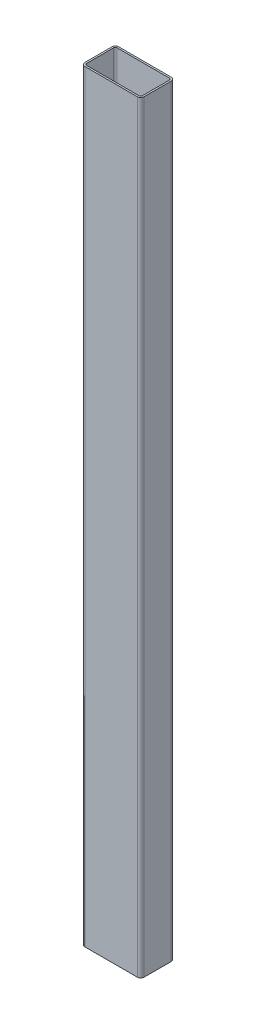
ISO-10303-21;
HEADER;
FILE_DESCRIPTION(('STEP AP214'),'2;1');
FILE_NAME('part.step','',(''),(''),'','','');
FILE_SCHEMA(('AUTOMOTIVE_DESIGN { 1 0 10303 214 1 1 1 1 }'));
ENDSEC;
DATA;
#1=APPLICATION_CONTEXT('core data for automotive mechanical design processes');
#2=APPLICATION_PROTOCOL_DEFINITION('international standard','automotive_design',2000,#1);
#3=PRODUCT_CONTEXT('',#1,'mechanical');
#4=PRODUCT('Part','Part','',(#3));
#5=PRODUCT_RELATED_PRODUCT_CATEGORY('part','',(#4));
#6=PRODUCT_DEFINITION_FORMATION('','',#4);
#7=PRODUCT_DEFINITION_CONTEXT('part definition',#1,'design');
#8=PRODUCT_DEFINITION('design','',#6,#7);
#9=PRODUCT_DEFINITION_SHAPE('','',#8);
#10=(LENGTH_UNIT() NAMED_UNIT(*) SI_UNIT(.MILLI.,.METRE.));
#11=(NAMED_UNIT(*) PLANE_ANGLE_UNIT() SI_UNIT($,.RADIAN.));
#12=(NAMED_UNIT(*) SI_UNIT($,.STERADIAN.) SOLID_ANGLE_UNIT());
#13=UNCERTAINTY_MEASURE_WITH_UNIT(LENGTH_MEASURE(1.E-05),#10,'distance_accuracy_value','');
#14=(GEOMETRIC_REPRESENTATION_CONTEXT(3) GLOBAL_UNCERTAINTY_ASSIGNED_CONTEXT((#13)) GLOBAL_UNIT_ASSIGNED_CONTEXT((#10,
#11,#12)) REPRESENTATION_CONTEXT('',''));
#15=CARTESIAN_POINT('',(0.,0.,0.));
#16=DIRECTION('',(0.,0.,1.));
#17=DIRECTION('',(1.,0.,0.));
#18=AXIS2_PLACEMENT_3D('',#15,#16,#17);
#19=CARTESIAN_POINT('',(15.5,450.,8.));
#20=DIRECTION('',(0.,1.,0.));
#21=DIRECTION('',(0.,0.,1.));
#22=AXIS2_PLACEMENT_3D('',#19,#20,#21);
#23=PLANE('',#22);
#24=CARTESIAN_POINT('',(15.5,450.,8.));
#25=DIRECTION('',(0.,1.,0.));
#26=DIRECTION('',(0.,0.,1.));
#27=AXIS2_PLACEMENT_3D('',#24,#25,#26);
#28=CIRCLE('',#27,2.);
#29=CARTESIAN_POINT('',(15.5,450.,10.));
#30=VERTEX_POINT('',#29);
#31=CARTESIAN_POINT('',(17.5,450.,7.99999999999998));
#32=VERTEX_POINT('',#31);
#33=EDGE_CURVE('E251',#30,#32,#28,.T.);
#34=ORIENTED_EDGE('',*,*,#33,.T.);
#35=DIRECTION('',(0.,0.,-1.));
#36=VECTOR('',#35,1.);
#37=CARTESIAN_POINT('',(17.5,450.,7.99999999999998));
#38=LINE('',#37,#36);
#39=CARTESIAN_POINT('',(17.5,450.,-7.99999999999999));
#40=VERTEX_POINT('',#39);
#41=EDGE_CURVE('E255',#32,#40,#38,.T.);
#42=ORIENTED_EDGE('',*,*,#41,.T.);
#43=CARTESIAN_POINT('',(15.5,450.,-8.00000000000001));
#44=DIRECTION('',(0.,1.,0.));
#45=DIRECTION('',(0.,0.,1.));
#46=AXIS2_PLACEMENT_3D('',#43,#44,#45);
#47=CIRCLE('',#46,2.);
#48=CARTESIAN_POINT('',(15.5,450.,-10.));
#49=VERTEX_POINT('',#48);
#50=EDGE_CURVE('E259',#40,#49,#47,.T.);
#51=ORIENTED_EDGE('',*,*,#50,.T.);
#52=DIRECTION('',(-1.,0.,0.));
#53=VECTOR('',#52,1.);
#54=CARTESIAN_POINT('',(15.5,450.,-10.));
#55=LINE('',#54,#53);
#56=CARTESIAN_POINT('',(-15.5,450.,-10.));
#57=VERTEX_POINT('',#56);
#58=EDGE_CURVE('E262',#49,#57,#55,.T.);
#59=ORIENTED_EDGE('',*,*,#58,.T.);
#60=CARTESIAN_POINT('',(-15.5,450.,-8.));
#61=DIRECTION('',(0.,1.,0.));
#62=DIRECTION('',(0.,0.,1.));
#63=AXIS2_PLACEMENT_3D('',#60,#61,#62);
#64=CIRCLE('',#63,2.);
#65=CARTESIAN_POINT('',(-17.5,450.,-7.99999999999999));
#66=VERTEX_POINT('',#65);
#67=EDGE_CURVE('E265',#57,#66,#64,.T.);
#68=ORIENTED_EDGE('',*,*,#67,.T.);
#69=DIRECTION('',(0.,0.,1.));
#70=VECTOR('',#69,1.);
#71=CARTESIAN_POINT('',(-17.5,450.,7.99999999999998));
#72=LINE('',#71,#70);
#73=CARTESIAN_POINT('',(-17.5,450.,7.99999999999998));
#74=VERTEX_POINT('',#73);
#75=EDGE_CURVE('E268',#66,#74,#72,.T.);
#76=ORIENTED_EDGE('',*,*,#75,.T.);
#77=CARTESIAN_POINT('',(-15.5,450.,8.));
#78=DIRECTION('',(0.,1.,0.));
#79=DIRECTION('',(0.,0.,-1.));
#80=AXIS2_PLACEMENT_3D('',#77,#78,#79);
#81=CIRCLE('',#80,2.);
#82=CARTESIAN_POINT('',(-15.5,450.,10.));
#83=VERTEX_POINT('',#82);
#84=EDGE_CURVE('E271',#74,#83,#81,.T.);
#85=ORIENTED_EDGE('',*,*,#84,.T.);
#86=DIRECTION('',(1.,0.,0.));
#87=VECTOR('',#86,1.);
#88=CARTESIAN_POINT('',(15.5,450.,10.));
#89=LINE('',#88,#87);
#90=EDGE_CURVE('E274',#83,#30,#89,.T.);
#91=ORIENTED_EDGE('',*,*,#90,.T.);
#92=EDGE_LOOP('',(#34,#42,#51,#59,#68,#76,#85,#91));
#93=FACE_BOUND('',#92,.T.);
#94=DIRECTION('',(0.,0.,-1.));
#95=VECTOR('',#94,1.);
#96=CARTESIAN_POINT('',(16.5,450.,7.99999999999998));
#97=LINE('',#96,#95);
#98=CARTESIAN_POINT('',(16.5,450.,7.99999999999998));
#99=VERTEX_POINT('',#98);
#100=CARTESIAN_POINT('',(16.5,450.,-8.));
#101=VERTEX_POINT('',#100);
#102=EDGE_CURVE('E171',#99,#101,#97,.T.);
#103=ORIENTED_EDGE('',*,*,#102,.F.);
#104=CARTESIAN_POINT('',(15.5,450.,8.));
#105=DIRECTION('',(0.,1.,0.));
#106=DIRECTION('',(0.,0.,1.));
#107=AXIS2_PLACEMENT_3D('',#104,#105,#106);
#108=CIRCLE('',#107,1.);
#109=CARTESIAN_POINT('',(15.5,450.,9.));
#110=VERTEX_POINT('',#109);
#111=EDGE_CURVE('E162',#110,#99,#108,.T.);
#112=ORIENTED_EDGE('',*,*,#111,.F.);
#113=DIRECTION('',(1.,0.,0.));
#114=VECTOR('',#113,1.);
#115=CARTESIAN_POINT('',(15.5,450.,9.));
#116=LINE('',#115,#114);
#117=CARTESIAN_POINT('',(-15.5,450.,9.));
#118=VERTEX_POINT('',#117);
#119=EDGE_CURVE('E203',#118,#110,#116,.T.);
#120=ORIENTED_EDGE('',*,*,#119,.F.);
#121=CARTESIAN_POINT('',(-15.5,450.,8.));
#122=DIRECTION('',(0.,1.,0.));
#123=DIRECTION('',(0.,0.,-1.));
#124=AXIS2_PLACEMENT_3D('',#121,#122,#123);
#125=CIRCLE('',#124,0.999999999999999);
#126=CARTESIAN_POINT('',(-16.5,450.,7.99999999999999));
#127=VERTEX_POINT('',#126);
#128=EDGE_CURVE('E200',#127,#118,#125,.T.);
#129=ORIENTED_EDGE('',*,*,#128,.F.);
#130=DIRECTION('',(0.,0.,1.));
#131=VECTOR('',#130,1.);
#132=CARTESIAN_POINT('',(-16.5,450.,7.99999999999999));
#133=LINE('',#132,#131);
#134=CARTESIAN_POINT('',(-16.5,450.,-7.99999999999999));
#135=VERTEX_POINT('',#134);
#136=EDGE_CURVE('E197',#135,#127,#133,.T.);
#137=ORIENTED_EDGE('',*,*,#136,.F.);
#138=CARTESIAN_POINT('',(-15.5,450.,-8.));
#139=DIRECTION('',(0.,1.,0.));
#140=DIRECTION('',(0.,0.,1.));
#141=AXIS2_PLACEMENT_3D('',#138,#139,#140);
#142=CIRCLE('',#141,0.999999999999999);
#143=CARTESIAN_POINT('',(-15.5,450.,-9.));
#144=VERTEX_POINT('',#143);
#145=EDGE_CURVE('E194',#144,#135,#142,.T.);
#146=ORIENTED_EDGE('',*,*,#145,.F.);
#147=DIRECTION('',(-1.,0.,0.));
#148=VECTOR('',#147,1.);
#149=CARTESIAN_POINT('',(15.5,450.,-9.00000000000001));
#150=LINE('',#149,#148);
#151=CARTESIAN_POINT('',(15.5,450.,-9.00000000000001));
#152=VERTEX_POINT('',#151);
#153=EDGE_CURVE('E189',#152,#144,#150,.T.);
#154=ORIENTED_EDGE('',*,*,#153,.F.);
#155=CARTESIAN_POINT('',(15.5,450.,-8.00000000000001));
#156=DIRECTION('',(0.,1.,0.));
#157=DIRECTION('',(0.,0.,1.));
#158=AXIS2_PLACEMENT_3D('',#155,#156,#157);
#159=CIRCLE('',#158,0.999999999999999);
#160=EDGE_CURVE('E185',#101,#152,#159,.T.);
#161=ORIENTED_EDGE('',*,*,#160,.F.);
#162=EDGE_LOOP('',(#103,#112,#120,#129,#137,#146,#154,#161));
#163=FACE_BOUND('',#162,.T.);
#164=ADVANCED_FACE('F48',(#93,#163),#23,.T.);
#165=CARTESIAN_POINT('',(15.5,0.,8.));
#166=DIRECTION('',(0.,1.,0.));
#167=DIRECTION('',(0.,0.,1.));
#168=AXIS2_PLACEMENT_3D('',#165,#166,#167);
#169=PLANE('',#168);
#170=CARTESIAN_POINT('',(15.5,0.,8.));
#171=DIRECTION('',(0.,1.,0.));
#172=DIRECTION('',(0.,0.,1.));
#173=AXIS2_PLACEMENT_3D('',#170,#171,#172);
#174=CIRCLE('',#173,2.);
#175=CARTESIAN_POINT('',(15.5,0.,10.));
#176=VERTEX_POINT('',#175);
#177=CARTESIAN_POINT('',(17.5,0.,7.99999999999998));
#178=VERTEX_POINT('',#177);
#179=EDGE_CURVE('E180',#176,#178,#174,.T.);
#180=ORIENTED_EDGE('',*,*,#179,.F.);
#181=DIRECTION('',(1.,0.,0.));
#182=VECTOR('',#181,1.);
#183=CARTESIAN_POINT('',(15.5,0.,10.));
#184=LINE('',#183,#182);
#185=CARTESIAN_POINT('',(-15.5,0.,10.));
#186=VERTEX_POINT('',#185);
#187=EDGE_CURVE('E256',#186,#176,#184,.T.);
#188=ORIENTED_EDGE('',*,*,#187,.F.);
#189=CARTESIAN_POINT('',(-15.5,0.,8.));
#190=DIRECTION('',(0.,1.,0.));
#191=DIRECTION('',(0.,0.,-1.));
#192=AXIS2_PLACEMENT_3D('',#189,#190,#191);
#193=CIRCLE('',#192,2.);
#194=CARTESIAN_POINT('',(-17.5,0.,7.99999999999998));
#195=VERTEX_POINT('',#194);
#196=EDGE_CURVE('E296',#195,#186,#193,.T.);
#197=ORIENTED_EDGE('',*,*,#196,.F.);
#198=DIRECTION('',(0.,0.,1.));
#199=VECTOR('',#198,1.);
#200=CARTESIAN_POINT('',(-17.5,0.,7.99999999999998));
#201=LINE('',#200,#199);
#202=CARTESIAN_POINT('',(-17.5,0.,-7.99999999999999));
#203=VERTEX_POINT('',#202);
#204=EDGE_CURVE('E293',#203,#195,#201,.T.);
#205=ORIENTED_EDGE('',*,*,#204,.F.);
#206=CARTESIAN_POINT('',(-15.5,0.,-8.));
#207=DIRECTION('',(0.,1.,0.));
#208=DIRECTION('',(0.,0.,1.));
#209=AXIS2_PLACEMENT_3D('',#206,#207,#208);
#210=CIRCLE('',#209,2.);
#211=CARTESIAN_POINT('',(-15.5,0.,-10.));
#212=VERTEX_POINT('',#211);
#213=EDGE_CURVE('E290',#212,#203,#210,.T.);
#214=ORIENTED_EDGE('',*,*,#213,.F.);
#215=DIRECTION('',(-1.,0.,0.));
#216=VECTOR('',#215,1.);
#217=CARTESIAN_POINT('',(15.5,0.,-10.));
#218=LINE('',#217,#216);
#219=CARTESIAN_POINT('',(15.5,0.,-10.));
#220=VERTEX_POINT('',#219);
#221=EDGE_CURVE('E287',#220,#212,#218,.T.);
#222=ORIENTED_EDGE('',*,*,#221,.F.);
#223=CARTESIAN_POINT('',(15.5,0.,-8.00000000000001));
#224=DIRECTION('',(0.,1.,0.));
#225=DIRECTION('',(0.,0.,1.));
#226=AXIS2_PLACEMENT_3D('',#223,#224,#225);
#227=CIRCLE('',#226,2.);
#228=CARTESIAN_POINT('',(17.5,0.,-7.99999999999999));
#229=VERTEX_POINT('',#228);
#230=EDGE_CURVE('E284',#229,#220,#227,.T.);
#231=ORIENTED_EDGE('',*,*,#230,.F.);
#232=DIRECTION('',(0.,0.,-1.));
#233=VECTOR('',#232,1.);
#234=CARTESIAN_POINT('',(17.5,0.,7.99999999999998));
#235=LINE('',#234,#233);
#236=EDGE_CURVE('E281',#178,#229,#235,.T.);
#237=ORIENTED_EDGE('',*,*,#236,.F.);
#238=EDGE_LOOP('',(#180,#188,#197,#205,#214,#222,#231,#237));
#239=FACE_BOUND('',#238,.T.);
#240=CARTESIAN_POINT('',(15.5,0.,8.));
#241=DIRECTION('',(0.,1.,0.));
#242=DIRECTION('',(0.,0.,1.));
#243=AXIS2_PLACEMENT_3D('',#240,#241,#242);
#244=CIRCLE('',#243,1.);
#245=CARTESIAN_POINT('',(15.5,0.,9.));
#246=VERTEX_POINT('',#245);
#247=CARTESIAN_POINT('',(16.5,0.,7.99999999999998));
#248=VERTEX_POINT('',#247);
#249=EDGE_CURVE('E72',#246,#248,#244,.T.);
#250=ORIENTED_EDGE('',*,*,#249,.T.);
#251=DIRECTION('',(0.,0.,-1.));
#252=VECTOR('',#251,1.);
#253=CARTESIAN_POINT('',(16.5,0.,7.99999999999998));
#254=LINE('',#253,#252);
#255=CARTESIAN_POINT('',(16.5,0.,-8.));
#256=VERTEX_POINT('',#255);
#257=EDGE_CURVE('E178',#248,#256,#254,.T.);
#258=ORIENTED_EDGE('',*,*,#257,.T.);
#259=CARTESIAN_POINT('',(15.5,0.,-8.00000000000001));
#260=DIRECTION('',(0.,1.,0.));
#261=DIRECTION('',(0.,0.,1.));
#262=AXIS2_PLACEMENT_3D('',#259,#260,#261);
#263=CIRCLE('',#262,0.999999999999999);
#264=CARTESIAN_POINT('',(15.5,0.,-9.00000000000001));
#265=VERTEX_POINT('',#264);
#266=EDGE_CURVE('E210',#256,#265,#263,.T.);
#267=ORIENTED_EDGE('',*,*,#266,.T.);
#268=DIRECTION('',(-1.,0.,0.));
#269=VECTOR('',#268,1.);
#270=CARTESIAN_POINT('',(15.5,0.,-9.00000000000001));
#271=LINE('',#270,#269);
#272=CARTESIAN_POINT('',(-15.5,0.,-9.));
#273=VERTEX_POINT('',#272);
#274=EDGE_CURVE('E214',#265,#273,#271,.T.);
#275=ORIENTED_EDGE('',*,*,#274,.T.);
#276=CARTESIAN_POINT('',(-15.5,0.,-8.));
#277=DIRECTION('',(0.,1.,0.));
#278=DIRECTION('',(0.,0.,1.));
#279=AXIS2_PLACEMENT_3D('',#276,#277,#278);
#280=CIRCLE('',#279,0.999999999999999);
#281=CARTESIAN_POINT('',(-16.5,0.,-7.99999999999999));
#282=VERTEX_POINT('',#281);
#283=EDGE_CURVE('E218',#273,#282,#280,.T.);
#284=ORIENTED_EDGE('',*,*,#283,.T.);
#285=DIRECTION('',(0.,0.,1.));
#286=VECTOR('',#285,1.);
#287=CARTESIAN_POINT('',(-16.5,0.,7.99999999999999));
#288=LINE('',#287,#286);
#289=CARTESIAN_POINT('',(-16.5,0.,7.99999999999999));
#290=VERTEX_POINT('',#289);
#291=EDGE_CURVE('E222',#282,#290,#288,.T.);
#292=ORIENTED_EDGE('',*,*,#291,.T.);
#293=CARTESIAN_POINT('',(-15.5,0.,8.));
#294=DIRECTION('',(0.,1.,0.));
#295=DIRECTION('',(0.,0.,-1.));
#296=AXIS2_PLACEMENT_3D('',#293,#294,#295);
#297=CIRCLE('',#296,0.999999999999999);
#298=CARTESIAN_POINT('',(-15.5,0.,9.));
#299=VERTEX_POINT('',#298);
#300=EDGE_CURVE('E226',#290,#299,#297,.T.);
#301=ORIENTED_EDGE('',*,*,#300,.T.);
#302=DIRECTION('',(1.,0.,0.));
#303=VECTOR('',#302,1.);
#304=CARTESIAN_POINT('',(15.5,0.,9.));
#305=LINE('',#304,#303);
#306=EDGE_CURVE('E172',#299,#246,#305,.T.);
#307=ORIENTED_EDGE('',*,*,#306,.T.);
#308=EDGE_LOOP('',(#250,#258,#267,#275,#284,#292,#301,#307));
#309=FACE_BOUND('',#308,.T.);
#310=ADVANCED_FACE('F335',(#239,#309),#169,.F.);
#311=CARTESIAN_POINT('',(15.5,450.,8.));
#312=DIRECTION('',(0.,-1.,0.));
#313=DIRECTION('',(0.,0.,-1.));
#314=AXIS2_PLACEMENT_3D('',#311,#312,#313);
#315=CYLINDRICAL_SURFACE('',#314,2.);
#316=ORIENTED_EDGE('',*,*,#179,.T.);
#317=DIRECTION('',(0.,-1.,0.));
#318=VECTOR('',#317,1.);
#319=CARTESIAN_POINT('',(17.5,450.,7.99999999999998));
#320=LINE('',#319,#318);
#321=EDGE_CURVE('E13',#32,#178,#320,.T.);
#322=ORIENTED_EDGE('',*,*,#321,.F.);
#323=ORIENTED_EDGE('',*,*,#33,.F.);
#324=DIRECTION('',(0.,-1.,0.));
#325=VECTOR('',#324,1.);
#326=CARTESIAN_POINT('',(15.5,450.,10.));
#327=LINE('',#326,#325);
#328=EDGE_CURVE('E277',#30,#176,#327,.T.);
#329=ORIENTED_EDGE('',*,*,#328,.T.);
#330=EDGE_LOOP('',(#316,#322,#323,#329));
#331=FACE_BOUND('',#330,.T.);
#332=ADVANCED_FACE('F50',(#331),#315,.T.);
#333=CARTESIAN_POINT('',(17.5,450.,7.99999999999998));
#334=DIRECTION('',(-1.,0.,0.));
#335=DIRECTION('',(0.,0.,1.));
#336=AXIS2_PLACEMENT_3D('',#333,#334,#335);
#337=PLANE('',#336);
#338=ORIENTED_EDGE('',*,*,#236,.T.);
#339=DIRECTION('',(0.,-1.,0.));
#340=VECTOR('',#339,1.);
#341=CARTESIAN_POINT('',(17.5,450.,-7.99999999999999));
#342=LINE('',#341,#340);
#343=EDGE_CURVE('E57',#40,#229,#342,.T.);
#344=ORIENTED_EDGE('',*,*,#343,.F.);
#345=ORIENTED_EDGE('',*,*,#41,.F.);
#346=ORIENTED_EDGE('',*,*,#321,.T.);
#347=EDGE_LOOP('',(#338,#344,#345,#346));
#348=FACE_BOUND('',#347,.T.);
#349=ADVANCED_FACE('F352',(#348),#337,.F.);
#350=CARTESIAN_POINT('',(15.5,450.,-8.00000000000001));
#351=DIRECTION('',(0.,-1.,0.));
#352=DIRECTION('',(0.,0.,-1.));
#353=AXIS2_PLACEMENT_3D('',#350,#351,#352);
#354=CYLINDRICAL_SURFACE('',#353,2.);
#355=ORIENTED_EDGE('',*,*,#230,.T.);
#356=DIRECTION('',(0.,-1.,0.));
#357=VECTOR('',#356,1.);
#358=CARTESIAN_POINT('',(15.5,450.,-10.));
#359=LINE('',#358,#357);
#360=EDGE_CURVE('E320',#49,#220,#359,.T.);
#361=ORIENTED_EDGE('',*,*,#360,.F.);
#362=ORIENTED_EDGE('',*,*,#50,.F.);
#363=ORIENTED_EDGE('',*,*,#343,.T.);
#364=EDGE_LOOP('',(#355,#361,#362,#363));
#365=FACE_BOUND('',#364,.T.);
#366=ADVANCED_FACE('F329',(#365),#354,.T.);
#367=CARTESIAN_POINT('',(15.5,450.,-10.));
#368=DIRECTION('',(0.,0.,1.));
#369=DIRECTION('',(1.,0.,0.));
#370=AXIS2_PLACEMENT_3D('',#367,#368,#369);
#371=PLANE('',#370);
#372=ORIENTED_EDGE('',*,*,#221,.T.);
#373=DIRECTION('',(0.,-1.,0.));
#374=VECTOR('',#373,1.);
#375=CARTESIAN_POINT('',(-15.5,450.,-10.));
#376=LINE('',#375,#374);
#377=EDGE_CURVE('E316',#57,#212,#376,.T.);
#378=ORIENTED_EDGE('',*,*,#377,.F.);
#379=ORIENTED_EDGE('',*,*,#58,.F.);
#380=ORIENTED_EDGE('',*,*,#360,.T.);
#381=EDGE_LOOP('',(#372,#378,#379,#380));
#382=FACE_BOUND('',#381,.T.);
#383=ADVANCED_FACE('F341',(#382),#371,.F.);
#384=CARTESIAN_POINT('',(-15.5,450.,-8.));
#385=DIRECTION('',(0.,-1.,0.));
#386=DIRECTION('',(0.,0.,-1.));
#387=AXIS2_PLACEMENT_3D('',#384,#385,#386);
#388=CYLINDRICAL_SURFACE('',#387,2.);
#389=ORIENTED_EDGE('',*,*,#213,.T.);
#390=DIRECTION('',(0.,-1.,0.));
#391=VECTOR('',#390,1.);
#392=CARTESIAN_POINT('',(-17.5,450.,-7.99999999999999));
#393=LINE('',#392,#391);
#394=EDGE_CURVE('E312',#66,#203,#393,.T.);
#395=ORIENTED_EDGE('',*,*,#394,.F.);
#396=ORIENTED_EDGE('',*,*,#67,.F.);
#397=ORIENTED_EDGE('',*,*,#377,.T.);
#398=EDGE_LOOP('',(#389,#395,#396,#397));
#399=FACE_BOUND('',#398,.T.);
#400=ADVANCED_FACE('F345',(#399),#388,.T.);
#401=CARTESIAN_POINT('',(-17.5,450.,7.99999999999998));
#402=DIRECTION('',(1.,0.,0.));
#403=DIRECTION('',(0.,0.,-1.));
#404=AXIS2_PLACEMENT_3D('',#401,#402,#403);
#405=PLANE('',#404);
#406=ORIENTED_EDGE('',*,*,#204,.T.);
#407=DIRECTION('',(0.,-1.,0.));
#408=VECTOR('',#407,1.);
#409=CARTESIAN_POINT('',(-17.5,450.,7.99999999999998));
#410=LINE('',#409,#408);
#411=EDGE_CURVE('E308',#74,#195,#410,.T.);
#412=ORIENTED_EDGE('',*,*,#411,.F.);
#413=ORIENTED_EDGE('',*,*,#75,.F.);
#414=ORIENTED_EDGE('',*,*,#394,.T.);
#415=EDGE_LOOP('',(#406,#412,#413,#414));
#416=FACE_BOUND('',#415,.T.);
#417=ADVANCED_FACE('F365',(#416),#405,.F.);
#418=CARTESIAN_POINT('',(-15.5,450.,8.));
#419=DIRECTION('',(0.,-1.,0.));
#420=DIRECTION('',(0.,0.,-1.));
#421=AXIS2_PLACEMENT_3D('',#418,#419,#420);
#422=CYLINDRICAL_SURFACE('',#421,2.);
#423=ORIENTED_EDGE('',*,*,#196,.T.);
#424=DIRECTION('',(0.,-1.,0.));
#425=VECTOR('',#424,1.);
#426=CARTESIAN_POINT('',(-15.5,450.,10.));
#427=LINE('',#426,#425);
#428=EDGE_CURVE('E304',#83,#186,#427,.T.);
#429=ORIENTED_EDGE('',*,*,#428,.F.);
#430=ORIENTED_EDGE('',*,*,#84,.F.);
#431=ORIENTED_EDGE('',*,*,#411,.T.);
#432=EDGE_LOOP('',(#423,#429,#430,#431));
#433=FACE_BOUND('',#432,.T.);
#434=ADVANCED_FACE('F363',(#433),#422,.T.);
#435=CARTESIAN_POINT('',(15.5,450.,10.));
#436=DIRECTION('',(0.,0.,-1.));
#437=DIRECTION('',(-1.,0.,0.));
#438=AXIS2_PLACEMENT_3D('',#435,#436,#437);
#439=PLANE('',#438);
#440=ORIENTED_EDGE('',*,*,#187,.T.);
#441=ORIENTED_EDGE('',*,*,#328,.F.);
#442=ORIENTED_EDGE('',*,*,#90,.F.);
#443=ORIENTED_EDGE('',*,*,#428,.T.);
#444=EDGE_LOOP('',(#440,#441,#442,#443));
#445=FACE_BOUND('',#444,.T.);
#446=ADVANCED_FACE('F358',(#445),#439,.F.);
#447=CARTESIAN_POINT('',(15.5,450.,8.));
#448=DIRECTION('',(0.,-1.,0.));
#449=DIRECTION('',(0.,0.,-1.));
#450=AXIS2_PLACEMENT_3D('',#447,#448,#449);
#451=CYLINDRICAL_SURFACE('',#450,1.);
#452=ORIENTED_EDGE('',*,*,#249,.F.);
#453=DIRECTION('',(0.,-1.,0.));
#454=VECTOR('',#453,1.);
#455=CARTESIAN_POINT('',(15.5,450.,9.));
#456=LINE('',#455,#454);
#457=EDGE_CURVE('E166',#110,#246,#456,.T.);
#458=ORIENTED_EDGE('',*,*,#457,.F.);
#459=ORIENTED_EDGE('',*,*,#111,.T.);
#460=DIRECTION('',(0.,-1.,0.));
#461=VECTOR('',#460,1.);
#462=CARTESIAN_POINT('',(16.5,450.,7.99999999999998));
#463=LINE('',#462,#461);
#464=EDGE_CURVE('E165',#99,#248,#463,.T.);
#465=ORIENTED_EDGE('',*,*,#464,.T.);
#466=EDGE_LOOP('',(#452,#458,#459,#465));
#467=FACE_BOUND('',#466,.T.);
#468=ADVANCED_FACE('F164',(#467),#451,.F.);
#469=CARTESIAN_POINT('',(16.5,450.,7.99999999999998));
#470=DIRECTION('',(-1.,0.,0.));
#471=DIRECTION('',(0.,0.,1.));
#472=AXIS2_PLACEMENT_3D('',#469,#470,#471);
#473=PLANE('',#472);
#474=ORIENTED_EDGE('',*,*,#257,.F.);
#475=ORIENTED_EDGE('',*,*,#464,.F.);
#476=ORIENTED_EDGE('',*,*,#102,.T.);
#477=DIRECTION('',(0.,-1.,0.));
#478=VECTOR('',#477,1.);
#479=CARTESIAN_POINT('',(16.5,450.,-8.));
#480=LINE('',#479,#478);
#481=EDGE_CURVE('E181',#101,#256,#480,.T.);
#482=ORIENTED_EDGE('',*,*,#481,.T.);
#483=EDGE_LOOP('',(#474,#475,#476,#482));
#484=FACE_BOUND('',#483,.T.);
#485=ADVANCED_FACE('F175',(#484),#473,.T.);
#486=CARTESIAN_POINT('',(15.5,450.,-8.00000000000001));
#487=DIRECTION('',(0.,-1.,0.));
#488=DIRECTION('',(0.,0.,-1.));
#489=AXIS2_PLACEMENT_3D('',#486,#487,#488);
#490=CYLINDRICAL_SURFACE('',#489,0.999999999999999);
#491=ORIENTED_EDGE('',*,*,#266,.F.);
#492=ORIENTED_EDGE('',*,*,#481,.F.);
#493=ORIENTED_EDGE('',*,*,#160,.T.);
#494=DIRECTION('',(0.,-1.,0.));
#495=VECTOR('',#494,1.);
#496=CARTESIAN_POINT('',(15.5,450.,-9.00000000000001));
#497=LINE('',#496,#495);
#498=EDGE_CURVE('E246',#152,#265,#497,.T.);
#499=ORIENTED_EDGE('',*,*,#498,.T.);
#500=EDGE_LOOP('',(#491,#492,#493,#499));
#501=FACE_BOUND('',#500,.T.);
#502=ADVANCED_FACE('F390',(#501),#490,.F.);
#503=CARTESIAN_POINT('',(15.5,450.,-9.00000000000001));
#504=DIRECTION('',(0.,0.,1.));
#505=DIRECTION('',(1.,0.,0.));
#506=AXIS2_PLACEMENT_3D('',#503,#504,#505);
#507=PLANE('',#506);
#508=ORIENTED_EDGE('',*,*,#274,.F.);
#509=ORIENTED_EDGE('',*,*,#498,.F.);
#510=ORIENTED_EDGE('',*,*,#153,.T.);
#511=DIRECTION('',(0.,-1.,0.));
#512=VECTOR('',#511,1.);
#513=CARTESIAN_POINT('',(-15.5,450.,-9.));
#514=LINE('',#513,#512);
#515=EDGE_CURVE('E243',#144,#273,#514,.T.);
#516=ORIENTED_EDGE('',*,*,#515,.T.);
#517=EDGE_LOOP('',(#508,#509,#510,#516));
#518=FACE_BOUND('',#517,.T.);
#519=ADVANCED_FACE('F394',(#518),#507,.T.);
#520=CARTESIAN_POINT('',(-15.5,450.,-8.));
#521=DIRECTION('',(0.,-1.,0.));
#522=DIRECTION('',(0.,0.,-1.));
#523=AXIS2_PLACEMENT_3D('',#520,#521,#522);
#524=CYLINDRICAL_SURFACE('',#523,0.999999999999999);
#525=ORIENTED_EDGE('',*,*,#283,.F.);
#526=ORIENTED_EDGE('',*,*,#515,.F.);
#527=ORIENTED_EDGE('',*,*,#145,.T.);
#528=DIRECTION('',(0.,-1.,0.));
#529=VECTOR('',#528,1.);
#530=CARTESIAN_POINT('',(-16.5,450.,-7.99999999999999));
#531=LINE('',#530,#529);
#532=EDGE_CURVE('E240',#135,#282,#531,.T.);
#533=ORIENTED_EDGE('',*,*,#532,.T.);
#534=EDGE_LOOP('',(#525,#526,#527,#533));
#535=FACE_BOUND('',#534,.T.);
#536=ADVANCED_FACE('F400',(#535),#524,.F.);
#537=CARTESIAN_POINT('',(-16.5,450.,7.99999999999999));
#538=DIRECTION('',(1.,0.,0.));
#539=DIRECTION('',(0.,0.,-1.));
#540=AXIS2_PLACEMENT_3D('',#537,#538,#539);
#541=PLANE('',#540);
#542=ORIENTED_EDGE('',*,*,#291,.F.);
#543=ORIENTED_EDGE('',*,*,#532,.F.);
#544=ORIENTED_EDGE('',*,*,#136,.T.);
#545=DIRECTION('',(0.,-1.,0.));
#546=VECTOR('',#545,1.);
#547=CARTESIAN_POINT('',(-16.5,450.,7.99999999999999));
#548=LINE('',#547,#546);
#549=EDGE_CURVE('E237',#127,#290,#548,.T.);
#550=ORIENTED_EDGE('',*,*,#549,.T.);
#551=EDGE_LOOP('',(#542,#543,#544,#550));
#552=FACE_BOUND('',#551,.T.);
#553=ADVANCED_FACE('F404',(#552),#541,.T.);
#554=CARTESIAN_POINT('',(-15.5,450.,8.));
#555=DIRECTION('',(0.,-1.,0.));
#556=DIRECTION('',(0.,0.,-1.));
#557=AXIS2_PLACEMENT_3D('',#554,#555,#556);
#558=CYLINDRICAL_SURFACE('',#557,0.999999999999999);
#559=ORIENTED_EDGE('',*,*,#300,.F.);
#560=ORIENTED_EDGE('',*,*,#549,.F.);
#561=ORIENTED_EDGE('',*,*,#128,.T.);
#562=DIRECTION('',(0.,-1.,0.));
#563=VECTOR('',#562,1.);
#564=CARTESIAN_POINT('',(-15.5,450.,9.));
#565=LINE('',#564,#563);
#566=EDGE_CURVE('E64',#118,#299,#565,.T.);
#567=ORIENTED_EDGE('',*,*,#566,.T.);
#568=EDGE_LOOP('',(#559,#560,#561,#567));
#569=FACE_BOUND('',#568,.T.);
#570=ADVANCED_FACE('F408',(#569),#558,.F.);
#571=CARTESIAN_POINT('',(15.5,450.,9.));
#572=DIRECTION('',(0.,0.,-1.));
#573=DIRECTION('',(-1.,0.,0.));
#574=AXIS2_PLACEMENT_3D('',#571,#572,#573);
#575=PLANE('',#574);
#576=ORIENTED_EDGE('',*,*,#306,.F.);
#577=ORIENTED_EDGE('',*,*,#566,.F.);
#578=ORIENTED_EDGE('',*,*,#119,.T.);
#579=ORIENTED_EDGE('',*,*,#457,.T.);
#580=EDGE_LOOP('',(#576,#577,#578,#579));
#581=FACE_BOUND('',#580,.T.);
#582=ADVANCED_FACE('F412',(#581),#575,.T.);
#583=CLOSED_SHELL('',(#164,#310,#332,#349,#366,#383,#400,#417,#434,#446,#468,#485,#502,#519,
#536,#553,#570,#582));
#584=MANIFOLD_SOLID_BREP('B2',#583);
#585=ADVANCED_BREP_SHAPE_REPRESENTATION('',(#18,#584),#14);
#586=SHAPE_DEFINITION_REPRESENTATION(#9,#585);
ENDSEC;
END-ISO-10303-21;
